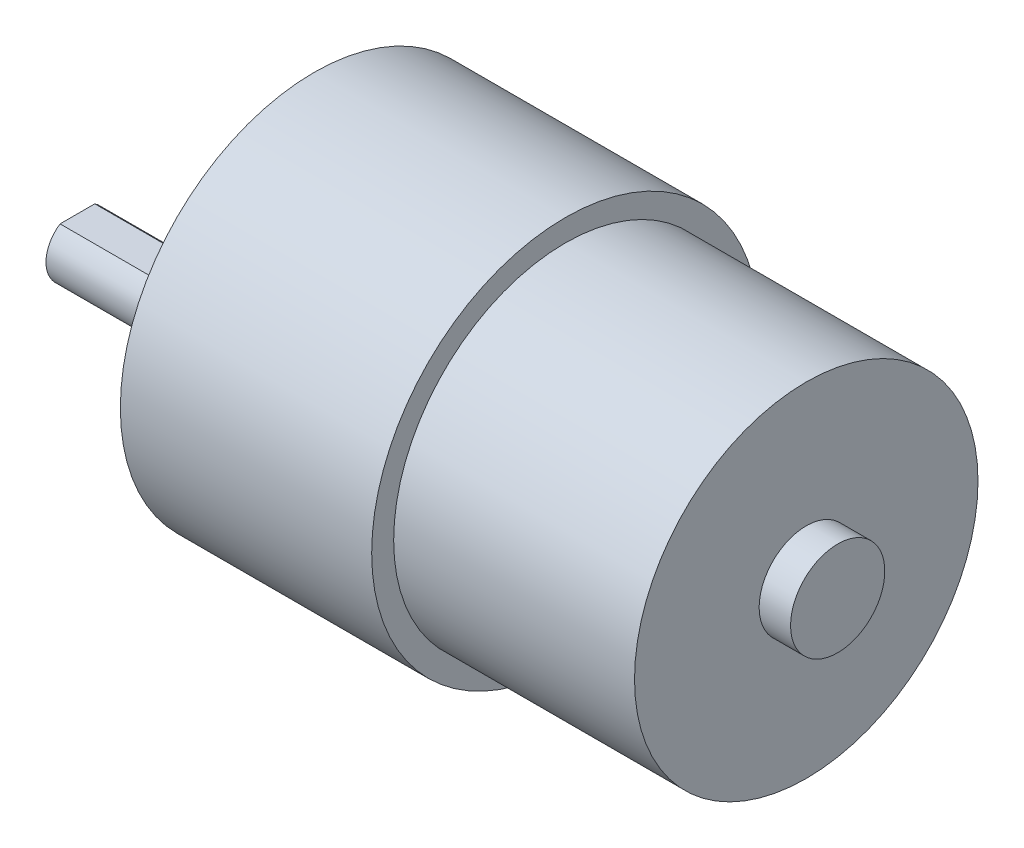
ISO-10303-21;
HEADER;
FILE_DESCRIPTION(('STEP AP214'),'2;1');
FILE_NAME('part.step','',(''),(''),'','','');
FILE_SCHEMA(('AUTOMOTIVE_DESIGN { 1 0 10303 214 1 1 1 1 }'));
ENDSEC;
DATA;
#1=APPLICATION_CONTEXT('core data for automotive mechanical design processes');
#2=APPLICATION_PROTOCOL_DEFINITION('international standard','automotive_design',2000,#1);
#3=PRODUCT_CONTEXT('',#1,'mechanical');
#4=PRODUCT('Part','Part','',(#3));
#5=PRODUCT_RELATED_PRODUCT_CATEGORY('part','',(#4));
#6=PRODUCT_DEFINITION_FORMATION('','',#4);
#7=PRODUCT_DEFINITION_CONTEXT('part definition',#1,'design');
#8=PRODUCT_DEFINITION('design','',#6,#7);
#9=PRODUCT_DEFINITION_SHAPE('','',#8);
#10=(LENGTH_UNIT() NAMED_UNIT(*) SI_UNIT(.MILLI.,.METRE.));
#11=(NAMED_UNIT(*) PLANE_ANGLE_UNIT() SI_UNIT($,.RADIAN.));
#12=(NAMED_UNIT(*) SI_UNIT($,.STERADIAN.) SOLID_ANGLE_UNIT());
#13=UNCERTAINTY_MEASURE_WITH_UNIT(LENGTH_MEASURE(1.E-05),#10,'distance_accuracy_value','');
#14=(GEOMETRIC_REPRESENTATION_CONTEXT(3) GLOBAL_UNCERTAINTY_ASSIGNED_CONTEXT((#13)) GLOBAL_UNIT_ASSIGNED_CONTEXT((#10,
#11,#12)) REPRESENTATION_CONTEXT('',''));
#15=CARTESIAN_POINT('',(0.,0.,0.));
#16=DIRECTION('',(0.,0.,1.));
#17=DIRECTION('',(1.,0.,0.));
#18=AXIS2_PLACEMENT_3D('',#15,#16,#17);
#19=CARTESIAN_POINT('',(-10.6,11.5000000000001,0.));
#20=DIRECTION('',(-1.,0.,0.));
#21=DIRECTION('',(0.,0.,1.));
#22=AXIS2_PLACEMENT_3D('',#19,#20,#21);
#23=PLANE('',#22);
#24=CARTESIAN_POINT('',(-10.6,11.5000000000001,0.));
#25=DIRECTION('',(-1.,0.,0.));
#26=DIRECTION('',(0.,0.,1.));
#27=AXIS2_PLACEMENT_3D('',#24,#25,#26);
#28=CIRCLE('',#27,3.);
#29=CARTESIAN_POINT('',(-10.6,14.0000000000001,1.65831239517773));
#30=VERTEX_POINT('',#29);
#31=CARTESIAN_POINT('',(-10.6,14.0000000000001,-1.65831239517767));
#32=VERTEX_POINT('',#31);
#33=EDGE_CURVE('E87',#30,#32,#28,.T.);
#34=ORIENTED_EDGE('',*,*,#33,.T.);
#35=DIRECTION('',(0.,0.,1.));
#36=VECTOR('',#35,1.);
#37=CARTESIAN_POINT('',(-10.6,14.0000000000001,-1.65831239517767));
#38=LINE('',#37,#36);
#39=EDGE_CURVE('E91',#32,#30,#38,.T.);
#40=ORIENTED_EDGE('',*,*,#39,.T.);
#41=EDGE_LOOP('',(#34,#40));
#42=FACE_BOUND('',#41,.T.);
#43=ADVANCED_FACE('F37',(#42),#23,.T.);
#44=CARTESIAN_POINT('',(0.,0.,0.));
#45=DIRECTION('',(-1.,0.,0.));
#46=DIRECTION('',(0.,0.,1.));
#47=AXIS2_PLACEMENT_3D('',#44,#45,#46);
#48=PLANE('',#47);
#49=CARTESIAN_POINT('',(0.,11.5000000000001,0.));
#50=DIRECTION('',(-1.,0.,0.));
#51=DIRECTION('',(0.,0.,1.));
#52=AXIS2_PLACEMENT_3D('',#49,#50,#51);
#53=CIRCLE('',#52,6.);
#54=CARTESIAN_POINT('',(0.,11.5000000000001,6.00000000000003));
#55=VERTEX_POINT('',#54);
#56=EDGE_CURVE('E96',#55,#55,#53,.T.);
#57=ORIENTED_EDGE('',*,*,#56,.F.);
#58=EDGE_LOOP('',(#57));
#59=FACE_BOUND('',#58,.T.);
#60=CARTESIAN_POINT('',(0.,31.9233937586589,-7.75));
#61=DIRECTION('',(-1.,0.,0.));
#62=DIRECTION('',(0.,0.,1.));
#63=AXIS2_PLACEMENT_3D('',#60,#61,#62);
#64=CIRCLE('',#63,0.749999999999987);
#65=CARTESIAN_POINT('',(0.,31.9233937586589,-7.00000000000001));
#66=VERTEX_POINT('',#65);
#67=EDGE_CURVE('E101',#66,#66,#64,.T.);
#68=ORIENTED_EDGE('',*,*,#67,.F.);
#69=EDGE_LOOP('',(#68));
#70=FACE_BOUND('',#69,.T.);
#71=CARTESIAN_POINT('',(0.,18.5000000000001,-15.5));
#72=DIRECTION('',(-1.,0.,0.));
#73=DIRECTION('',(0.,0.,1.));
#74=AXIS2_PLACEMENT_3D('',#71,#72,#73);
#75=CIRCLE('',#74,0.74999999999999);
#76=CARTESIAN_POINT('',(0.,18.5000000000001,-14.75));
#77=VERTEX_POINT('',#76);
#78=EDGE_CURVE('E109',#77,#77,#75,.T.);
#79=ORIENTED_EDGE('',*,*,#78,.F.);
#80=EDGE_LOOP('',(#79));
#81=FACE_BOUND('',#80,.T.);
#82=CARTESIAN_POINT('',(0.,5.07660624134133,-7.75));
#83=DIRECTION('',(-1.,0.,0.));
#84=DIRECTION('',(0.,0.,1.));
#85=AXIS2_PLACEMENT_3D('',#82,#83,#84);
#86=CIRCLE('',#85,0.749999999999989);
#87=CARTESIAN_POINT('',(0.,5.07660624134133,-7.00000000000001));
#88=VERTEX_POINT('',#87);
#89=EDGE_CURVE('E115',#88,#88,#86,.T.);
#90=ORIENTED_EDGE('',*,*,#89,.F.);
#91=EDGE_LOOP('',(#90));
#92=FACE_BOUND('',#91,.T.);
#93=CARTESIAN_POINT('',(0.,18.4999999999999,15.5));
#94=DIRECTION('',(-1.,0.,0.));
#95=DIRECTION('',(0.,0.,1.));
#96=AXIS2_PLACEMENT_3D('',#93,#94,#95);
#97=CIRCLE('',#96,0.74999999999999);
#98=CARTESIAN_POINT('',(0.,18.4999999999999,16.25));
#99=VERTEX_POINT('',#98);
#100=EDGE_CURVE('E121',#99,#99,#97,.T.);
#101=ORIENTED_EDGE('',*,*,#100,.F.);
#102=EDGE_LOOP('',(#101));
#103=FACE_BOUND('',#102,.T.);
#104=CARTESIAN_POINT('',(0.,18.5,0.));
#105=DIRECTION('',(-1.,0.,0.));
#106=DIRECTION('',(0.,0.,1.));
#107=AXIS2_PLACEMENT_3D('',#104,#105,#106);
#108=CIRCLE('',#107,18.5);
#109=CARTESIAN_POINT('',(0.,18.5,18.5));
#110=VERTEX_POINT('',#109);
#111=EDGE_CURVE('E127',#110,#110,#108,.T.);
#112=ORIENTED_EDGE('',*,*,#111,.T.);
#113=EDGE_LOOP('',(#112));
#114=FACE_BOUND('',#113,.T.);
#115=ADVANCED_FACE('F39',(#59,#70,#81,#92,#103,#114),#48,.T.);
#116=CARTESIAN_POINT('',(50.,0.,0.));
#117=DIRECTION('',(1.,0.,0.));
#118=DIRECTION('',(0.,0.,-1.));
#119=AXIS2_PLACEMENT_3D('',#116,#117,#118);
#120=PLANE('',#119);
#121=CARTESIAN_POINT('',(50.,18.5,0.));
#122=DIRECTION('',(-1.,0.,0.));
#123=DIRECTION('',(0.,0.,1.));
#124=AXIS2_PLACEMENT_3D('',#121,#122,#123);
#125=CIRCLE('',#124,4.50000000000001);
#126=CARTESIAN_POINT('',(50.,18.5,4.50000000000001));
#127=VERTEX_POINT('',#126);
#128=EDGE_CURVE('E41',#127,#127,#125,.T.);
#129=ORIENTED_EDGE('',*,*,#128,.F.);
#130=EDGE_LOOP('',(#129));
#131=FACE_BOUND('',#130,.T.);
#132=ADVANCED_FACE('F148',(#131),#120,.T.);
#133=CARTESIAN_POINT('',(0.,18.5,0.));
#134=DIRECTION('',(-1.,0.,0.));
#135=DIRECTION('',(0.,0.,1.));
#136=AXIS2_PLACEMENT_3D('',#133,#134,#135);
#137=CYLINDRICAL_SURFACE('',#136,4.50000000000001);
#138=ORIENTED_EDGE('',*,*,#128,.T.);
#139=EDGE_LOOP('',(#138));
#140=FACE_BOUND('',#139,.T.);
#141=CARTESIAN_POINT('',(47.,18.5,0.));
#142=DIRECTION('',(-1.,0.,0.));
#143=DIRECTION('',(0.,0.,1.));
#144=AXIS2_PLACEMENT_3D('',#141,#142,#143);
#145=CIRCLE('',#144,4.50000000000001);
#146=CARTESIAN_POINT('',(47.,18.5,4.50000000000001));
#147=VERTEX_POINT('',#146);
#148=EDGE_CURVE('E138',#147,#147,#145,.T.);
#149=ORIENTED_EDGE('',*,*,#148,.F.);
#150=EDGE_LOOP('',(#149));
#151=FACE_BOUND('',#150,.T.);
#152=ADVANCED_FACE('F145',(#140,#151),#137,.T.);
#153=CARTESIAN_POINT('',(47.,0.,0.));
#154=DIRECTION('',(-1.,0.,0.));
#155=DIRECTION('',(0.,0.,1.));
#156=AXIS2_PLACEMENT_3D('',#153,#154,#155);
#157=PLANE('',#156);
#158=CARTESIAN_POINT('',(47.,18.5,0.));
#159=DIRECTION('',(-1.,0.,0.));
#160=DIRECTION('',(0.,0.,1.));
#161=AXIS2_PLACEMENT_3D('',#158,#159,#160);
#162=CIRCLE('',#161,16.4);
#163=CARTESIAN_POINT('',(47.,18.5,16.4));
#164=VERTEX_POINT('',#163);
#165=EDGE_CURVE('E136',#164,#164,#162,.T.);
#166=ORIENTED_EDGE('',*,*,#165,.F.);
#167=EDGE_LOOP('',(#166));
#168=FACE_BOUND('',#167,.T.);
#169=ORIENTED_EDGE('',*,*,#148,.T.);
#170=EDGE_LOOP('',(#169));
#171=FACE_BOUND('',#170,.T.);
#172=ADVANCED_FACE('F154',(#168,#171),#157,.F.);
#173=CARTESIAN_POINT('',(0.,18.5,0.));
#174=DIRECTION('',(-1.,0.,0.));
#175=DIRECTION('',(0.,0.,1.));
#176=AXIS2_PLACEMENT_3D('',#173,#174,#175);
#177=CYLINDRICAL_SURFACE('',#176,16.4);
#178=ORIENTED_EDGE('',*,*,#165,.T.);
#179=EDGE_LOOP('',(#178));
#180=FACE_BOUND('',#179,.T.);
#181=CARTESIAN_POINT('',(24.,18.5,0.));
#182=DIRECTION('',(-1.,0.,0.));
#183=DIRECTION('',(0.,0.,1.));
#184=AXIS2_PLACEMENT_3D('',#181,#182,#183);
#185=CIRCLE('',#184,16.4);
#186=CARTESIAN_POINT('',(24.,18.5,16.4));
#187=VERTEX_POINT('',#186);
#188=EDGE_CURVE('E133',#187,#187,#185,.T.);
#189=ORIENTED_EDGE('',*,*,#188,.F.);
#190=EDGE_LOOP('',(#189));
#191=FACE_BOUND('',#190,.T.);
#192=ADVANCED_FACE('F213',(#180,#191),#177,.T.);
#193=CARTESIAN_POINT('',(24.,0.,0.));
#194=DIRECTION('',(-1.,0.,0.));
#195=DIRECTION('',(0.,0.,1.));
#196=AXIS2_PLACEMENT_3D('',#193,#194,#195);
#197=PLANE('',#196);
#198=CARTESIAN_POINT('',(24.,18.5,0.));
#199=DIRECTION('',(-1.,0.,0.));
#200=DIRECTION('',(0.,0.,1.));
#201=AXIS2_PLACEMENT_3D('',#198,#199,#200);
#202=CIRCLE('',#201,18.5);
#203=CARTESIAN_POINT('',(24.,18.5,18.5));
#204=VERTEX_POINT('',#203);
#205=EDGE_CURVE('E130',#204,#204,#202,.T.);
#206=ORIENTED_EDGE('',*,*,#205,.F.);
#207=EDGE_LOOP('',(#206));
#208=FACE_BOUND('',#207,.T.);
#209=ORIENTED_EDGE('',*,*,#188,.T.);
#210=EDGE_LOOP('',(#209));
#211=FACE_BOUND('',#210,.T.);
#212=ADVANCED_FACE('F209',(#208,#211),#197,.F.);
#213=CARTESIAN_POINT('',(0.,18.5,0.));
#214=DIRECTION('',(-1.,0.,0.));
#215=DIRECTION('',(0.,0.,1.));
#216=AXIS2_PLACEMENT_3D('',#213,#214,#215);
#217=CYLINDRICAL_SURFACE('',#216,18.5);
#218=ORIENTED_EDGE('',*,*,#205,.T.);
#219=EDGE_LOOP('',(#218));
#220=FACE_BOUND('',#219,.T.);
#221=ORIENTED_EDGE('',*,*,#111,.F.);
#222=EDGE_LOOP('',(#221));
#223=FACE_BOUND('',#222,.T.);
#224=ADVANCED_FACE('F206',(#220,#223),#217,.T.);
#225=CARTESIAN_POINT('',(10.,18.4999999999999,15.5));
#226=DIRECTION('',(-1.,0.,0.));
#227=DIRECTION('',(0.,0.,1.));
#228=AXIS2_PLACEMENT_3D('',#225,#226,#227);
#229=CONICAL_SURFACE('',#228,0.749999999999997,1.02974425867665);
#230=CARTESIAN_POINT('',(10.4506454642707,18.4999999999999,15.5));
#231=VERTEX_POINT('',#230);
#232=VERTEX_LOOP('',#231);
#233=FACE_BOUND('',#232,.T.);
#234=CARTESIAN_POINT('',(10.,18.4999999999999,15.5));
#235=DIRECTION('',(-1.,0.,0.));
#236=DIRECTION('',(0.,0.,1.));
#237=AXIS2_PLACEMENT_3D('',#234,#235,#236);
#238=CIRCLE('',#237,0.749999999999997);
#239=CARTESIAN_POINT('',(10.,18.4999999999999,16.25));
#240=VERTEX_POINT('',#239);
#241=EDGE_CURVE('E124',#240,#240,#238,.T.);
#242=ORIENTED_EDGE('',*,*,#241,.T.);
#243=EDGE_LOOP('',(#242));
#244=FACE_BOUND('',#243,.T.);
#245=ADVANCED_FACE('F202',(#233,#244),#229,.F.);
#246=CARTESIAN_POINT('',(0.,18.4999999999999,15.5));
#247=DIRECTION('',(-1.,0.,0.));
#248=DIRECTION('',(0.,0.,1.));
#249=AXIS2_PLACEMENT_3D('',#246,#247,#248);
#250=CYLINDRICAL_SURFACE('',#249,0.749999999999994);
#251=ORIENTED_EDGE('',*,*,#241,.F.);
#252=EDGE_LOOP('',(#251));
#253=FACE_BOUND('',#252,.T.);
#254=ORIENTED_EDGE('',*,*,#100,.T.);
#255=EDGE_LOOP('',(#254));
#256=FACE_BOUND('',#255,.T.);
#257=ADVANCED_FACE('F198',(#253,#256),#250,.F.);
#258=CARTESIAN_POINT('',(10.,5.07660624134133,-7.75));
#259=DIRECTION('',(-1.,0.,0.));
#260=DIRECTION('',(0.,0.,1.));
#261=AXIS2_PLACEMENT_3D('',#258,#259,#260);
#262=CONICAL_SURFACE('',#261,0.749999999999999,1.02974425867665);
#263=CARTESIAN_POINT('',(10.4506454642707,5.07660624134132,-7.75));
#264=VERTEX_POINT('',#263);
#265=VERTEX_LOOP('',#264);
#266=FACE_BOUND('',#265,.T.);
#267=CARTESIAN_POINT('',(10.,5.07660624134133,-7.75));
#268=DIRECTION('',(-1.,0.,0.));
#269=DIRECTION('',(0.,0.,1.));
#270=AXIS2_PLACEMENT_3D('',#267,#268,#269);
#271=CIRCLE('',#270,0.749999999999999);
#272=CARTESIAN_POINT('',(10.,5.07660624134133,-7.));
#273=VERTEX_POINT('',#272);
#274=EDGE_CURVE('E118',#273,#273,#271,.T.);
#275=ORIENTED_EDGE('',*,*,#274,.T.);
#276=EDGE_LOOP('',(#275));
#277=FACE_BOUND('',#276,.T.);
#278=ADVANCED_FACE('F194',(#266,#277),#262,.F.);
#279=CARTESIAN_POINT('',(0.,5.07660624134133,-7.75));
#280=DIRECTION('',(-1.,0.,0.));
#281=DIRECTION('',(0.,0.,1.));
#282=AXIS2_PLACEMENT_3D('',#279,#280,#281);
#283=CYLINDRICAL_SURFACE('',#282,0.749999999999994);
#284=ORIENTED_EDGE('',*,*,#274,.F.);
#285=EDGE_LOOP('',(#284));
#286=FACE_BOUND('',#285,.T.);
#287=ORIENTED_EDGE('',*,*,#89,.T.);
#288=EDGE_LOOP('',(#287));
#289=FACE_BOUND('',#288,.T.);
#290=ADVANCED_FACE('F190',(#286,#289),#283,.F.);
#291=CARTESIAN_POINT('',(10.,18.5000000000001,-15.5));
#292=DIRECTION('',(-1.,0.,0.));
#293=DIRECTION('',(0.,0.,1.));
#294=AXIS2_PLACEMENT_3D('',#291,#292,#293);
#295=CONICAL_SURFACE('',#294,0.749999999999997,1.02974425867665);
#296=CARTESIAN_POINT('',(10.4506454642707,18.5000000000001,-15.5));
#297=VERTEX_POINT('',#296);
#298=VERTEX_LOOP('',#297);
#299=FACE_BOUND('',#298,.T.);
#300=CARTESIAN_POINT('',(10.,18.5000000000001,-15.5));
#301=DIRECTION('',(-1.,0.,0.));
#302=DIRECTION('',(0.,0.,1.));
#303=AXIS2_PLACEMENT_3D('',#300,#301,#302);
#304=CIRCLE('',#303,0.749999999999997);
#305=CARTESIAN_POINT('',(10.,18.5000000000001,-14.75));
#306=VERTEX_POINT('',#305);
#307=EDGE_CURVE('E112',#306,#306,#304,.T.);
#308=ORIENTED_EDGE('',*,*,#307,.T.);
#309=EDGE_LOOP('',(#308));
#310=FACE_BOUND('',#309,.T.);
#311=ADVANCED_FACE('F186',(#299,#310),#295,.F.);
#312=CARTESIAN_POINT('',(0.,18.5000000000001,-15.5));
#313=DIRECTION('',(-1.,0.,0.));
#314=DIRECTION('',(0.,0.,1.));
#315=AXIS2_PLACEMENT_3D('',#312,#313,#314);
#316=CYLINDRICAL_SURFACE('',#315,0.749999999999994);
#317=ORIENTED_EDGE('',*,*,#307,.F.);
#318=EDGE_LOOP('',(#317));
#319=FACE_BOUND('',#318,.T.);
#320=ORIENTED_EDGE('',*,*,#78,.T.);
#321=EDGE_LOOP('',(#320));
#322=FACE_BOUND('',#321,.T.);
#323=ADVANCED_FACE('F182',(#319,#322),#316,.F.);
#324=CARTESIAN_POINT('',(10.,31.9233937586589,-7.75));
#325=DIRECTION('',(-1.,0.,0.));
#326=DIRECTION('',(0.,0.,1.));
#327=AXIS2_PLACEMENT_3D('',#324,#325,#326);
#328=CONICAL_SURFACE('',#327,0.750000000000001,1.02974425867665);
#329=CARTESIAN_POINT('',(10.4506454642707,31.9233937586589,-7.75));
#330=VERTEX_POINT('',#329);
#331=VERTEX_LOOP('',#330);
#332=FACE_BOUND('',#331,.T.);
#333=CARTESIAN_POINT('',(10.,31.9233937586589,-7.75));
#334=DIRECTION('',(-1.,0.,0.));
#335=DIRECTION('',(0.,0.,1.));
#336=AXIS2_PLACEMENT_3D('',#333,#334,#335);
#337=CIRCLE('',#336,0.750000000000001);
#338=CARTESIAN_POINT('',(10.,31.9233937586589,-7.));
#339=VERTEX_POINT('',#338);
#340=EDGE_CURVE('E106',#339,#339,#337,.T.);
#341=ORIENTED_EDGE('',*,*,#340,.T.);
#342=EDGE_LOOP('',(#341));
#343=FACE_BOUND('',#342,.T.);
#344=ADVANCED_FACE('F178',(#332,#343),#328,.F.);
#345=CARTESIAN_POINT('',(0.,31.9233937586589,-7.75));
#346=DIRECTION('',(-1.,0.,0.));
#347=DIRECTION('',(0.,0.,1.));
#348=AXIS2_PLACEMENT_3D('',#345,#346,#347);
#349=CYLINDRICAL_SURFACE('',#348,0.749999999999994);
#350=ORIENTED_EDGE('',*,*,#340,.F.);
#351=EDGE_LOOP('',(#350));
#352=FACE_BOUND('',#351,.T.);
#353=ORIENTED_EDGE('',*,*,#67,.T.);
#354=EDGE_LOOP('',(#353));
#355=FACE_BOUND('',#354,.T.);
#356=ADVANCED_FACE('F174',(#352,#355),#349,.F.);
#357=CARTESIAN_POINT('',(-4.6,11.5000000000001,0.));
#358=DIRECTION('',(1.,0.,0.));
#359=DIRECTION('',(0.,0.,-1.));
#360=AXIS2_PLACEMENT_3D('',#357,#358,#359);
#361=CYLINDRICAL_SURFACE('',#360,6.);
#362=CARTESIAN_POINT('',(-4.6,11.5000000000001,0.));
#363=DIRECTION('',(-1.,0.,0.));
#364=DIRECTION('',(0.,0.,1.));
#365=AXIS2_PLACEMENT_3D('',#362,#363,#364);
#366=CIRCLE('',#365,6.);
#367=CARTESIAN_POINT('',(-4.6,11.5000000000001,6.00000000000003));
#368=VERTEX_POINT('',#367);
#369=EDGE_CURVE('E98',#368,#368,#366,.T.);
#370=ORIENTED_EDGE('',*,*,#369,.F.);
#371=EDGE_LOOP('',(#370));
#372=FACE_BOUND('',#371,.T.);
#373=ORIENTED_EDGE('',*,*,#56,.T.);
#374=EDGE_LOOP('',(#373));
#375=FACE_BOUND('',#374,.T.);
#376=ADVANCED_FACE('F170',(#372,#375),#361,.T.);
#377=CARTESIAN_POINT('',(-4.6,11.5000000000001,0.));
#378=DIRECTION('',(-1.,0.,0.));
#379=DIRECTION('',(0.,0.,1.));
#380=AXIS2_PLACEMENT_3D('',#377,#378,#379);
#381=PLANE('',#380);
#382=CARTESIAN_POINT('',(-4.6,11.5000000000001,0.));
#383=DIRECTION('',(-1.,0.,0.));
#384=DIRECTION('',(0.,0.,1.));
#385=AXIS2_PLACEMENT_3D('',#382,#383,#384);
#386=CIRCLE('',#385,3.);
#387=CARTESIAN_POINT('',(-4.6,11.5000000000001,3.00000000000003));
#388=VERTEX_POINT('',#387);
#389=EDGE_CURVE('E11',#388,#388,#386,.T.);
#390=ORIENTED_EDGE('',*,*,#389,.F.);
#391=EDGE_LOOP('',(#390));
#392=FACE_BOUND('',#391,.T.);
#393=ORIENTED_EDGE('',*,*,#369,.T.);
#394=EDGE_LOOP('',(#393));
#395=FACE_BOUND('',#394,.T.);
#396=ADVANCED_FACE('F167',(#392,#395),#381,.T.);
#397=CARTESIAN_POINT('',(-10.6,11.5000000000001,0.));
#398=DIRECTION('',(1.,0.,0.));
#399=DIRECTION('',(0.,0.,-1.));
#400=AXIS2_PLACEMENT_3D('',#397,#398,#399);
#401=CYLINDRICAL_SURFACE('',#400,3.);
#402=ORIENTED_EDGE('',*,*,#33,.F.);
#403=DIRECTION('',(1.,0.,0.));
#404=VECTOR('',#403,1.);
#405=CARTESIAN_POINT('',(-22.6,14.0000000000001,1.65831239517773));
#406=LINE('',#405,#404);
#407=CARTESIAN_POINT('',(-22.6,14.0000000000001,1.65831239517773));
#408=VERTEX_POINT('',#407);
#409=EDGE_CURVE('E53',#408,#30,#406,.T.);
#410=ORIENTED_EDGE('',*,*,#409,.F.);
#411=CARTESIAN_POINT('',(-22.6,11.5000000000001,0.));
#412=DIRECTION('',(-1.,0.,0.));
#413=DIRECTION('',(0.,0.,1.));
#414=AXIS2_PLACEMENT_3D('',#411,#412,#413);
#415=CIRCLE('',#414,3.);
#416=CARTESIAN_POINT('',(-22.6,14.0000000000001,-1.65831239517767));
#417=VERTEX_POINT('',#416);
#418=EDGE_CURVE('E78',#417,#408,#415,.T.);
#419=ORIENTED_EDGE('',*,*,#418,.F.);
#420=DIRECTION('',(1.,0.,0.));
#421=VECTOR('',#420,1.);
#422=CARTESIAN_POINT('',(-22.6,14.0000000000001,-1.65831239517767));
#423=LINE('',#422,#421);
#424=EDGE_CURVE('E88',#417,#32,#423,.T.);
#425=ORIENTED_EDGE('',*,*,#424,.T.);
#426=EDGE_LOOP('',(#402,#410,#419,#425));
#427=FACE_BOUND('',#426,.T.);
#428=ORIENTED_EDGE('',*,*,#389,.T.);
#429=EDGE_LOOP('',(#428));
#430=FACE_BOUND('',#429,.T.);
#431=ADVANCED_FACE('F84',(#427,#430),#401,.T.);
#432=CARTESIAN_POINT('',(-22.6,14.0000000000001,-1.65831239517767));
#433=DIRECTION('',(0.,1.,0.));
#434=DIRECTION('',(0.,0.,1.));
#435=AXIS2_PLACEMENT_3D('',#432,#433,#434);
#436=PLANE('',#435);
#437=ORIENTED_EDGE('',*,*,#39,.F.);
#438=ORIENTED_EDGE('',*,*,#424,.F.);
#439=DIRECTION('',(0.,0.,1.));
#440=VECTOR('',#439,1.);
#441=CARTESIAN_POINT('',(-22.6,14.0000000000001,-1.65831239517767));
#442=LINE('',#441,#440);
#443=EDGE_CURVE('E80',#417,#408,#442,.T.);
#444=ORIENTED_EDGE('',*,*,#443,.T.);
#445=ORIENTED_EDGE('',*,*,#409,.T.);
#446=EDGE_LOOP('',(#437,#438,#444,#445));
#447=FACE_BOUND('',#446,.T.);
#448=ADVANCED_FACE('F90',(#447),#436,.T.);
#449=CARTESIAN_POINT('',(-22.6,11.5000000000001,0.));
#450=DIRECTION('',(-1.,0.,0.));
#451=DIRECTION('',(0.,0.,1.));
#452=AXIS2_PLACEMENT_3D('',#449,#450,#451);
#453=PLANE('',#452);
#454=ORIENTED_EDGE('',*,*,#443,.F.);
#455=ORIENTED_EDGE('',*,*,#418,.T.);
#456=EDGE_LOOP('',(#454,#455));
#457=FACE_BOUND('',#456,.T.);
#458=ADVANCED_FACE('F79',(#457),#453,.T.);
#459=CLOSED_SHELL('',(#43,#115,#132,#152,#172,#192,#212,#224,#245,#257,#278,#290,#311,#323,#344,
#356,#376,#396,#431,#448,#458));
#460=MANIFOLD_SOLID_BREP('B2',#459);
#461=ADVANCED_BREP_SHAPE_REPRESENTATION('',(#18,#460),#14);
#462=SHAPE_DEFINITION_REPRESENTATION(#9,#461);
ENDSEC;
END-ISO-10303-21;
